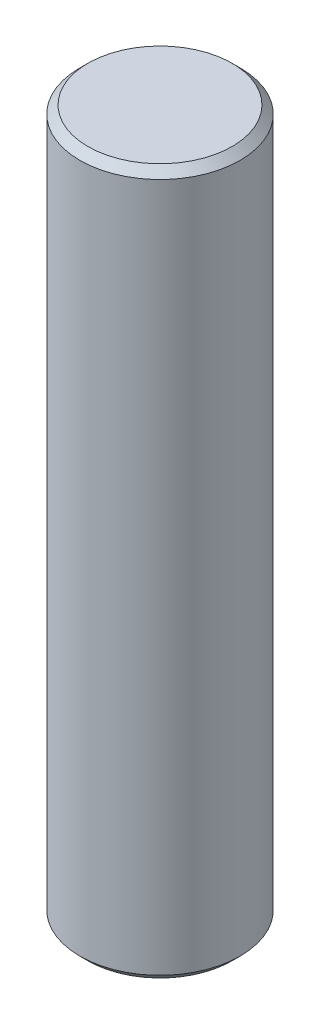
ISO-10303-21;
HEADER;
FILE_DESCRIPTION(('STEP AP214'),'2;1');
FILE_NAME('part.step','',(''),(''),'','','');
FILE_SCHEMA(('AUTOMOTIVE_DESIGN { 1 0 10303 214 1 1 1 1 }'));
ENDSEC;
DATA;
#1=APPLICATION_CONTEXT('core data for automotive mechanical design processes');
#2=APPLICATION_PROTOCOL_DEFINITION('international standard','automotive_design',2000,#1);
#3=PRODUCT_CONTEXT('',#1,'mechanical');
#4=PRODUCT('Part','Part','',(#3));
#5=PRODUCT_RELATED_PRODUCT_CATEGORY('part','',(#4));
#6=PRODUCT_DEFINITION_FORMATION('','',#4);
#7=PRODUCT_DEFINITION_CONTEXT('part definition',#1,'design');
#8=PRODUCT_DEFINITION('design','',#6,#7);
#9=PRODUCT_DEFINITION_SHAPE('','',#8);
#10=(LENGTH_UNIT() NAMED_UNIT(*) SI_UNIT(.MILLI.,.METRE.));
#11=(NAMED_UNIT(*) PLANE_ANGLE_UNIT() SI_UNIT($,.RADIAN.));
#12=(NAMED_UNIT(*) SI_UNIT($,.STERADIAN.) SOLID_ANGLE_UNIT());
#13=UNCERTAINTY_MEASURE_WITH_UNIT(LENGTH_MEASURE(1.E-05),#10,'distance_accuracy_value','');
#14=(GEOMETRIC_REPRESENTATION_CONTEXT(3) GLOBAL_UNCERTAINTY_ASSIGNED_CONTEXT((#13)) GLOBAL_UNIT_ASSIGNED_CONTEXT((#10,
#11,#12)) REPRESENTATION_CONTEXT('',''));
#15=CARTESIAN_POINT('',(0.,0.,0.));
#16=DIRECTION('',(0.,0.,1.));
#17=DIRECTION('',(1.,0.,0.));
#18=AXIS2_PLACEMENT_3D('',#15,#16,#17);
#19=CARTESIAN_POINT('',(0.,11.,0.));
#20=DIRECTION('',(0.,-1.,0.));
#21=DIRECTION('',(0.,0.,-1.));
#22=AXIS2_PLACEMENT_3D('',#19,#20,#21);
#23=CYLINDRICAL_SURFACE('',#22,2.5);
#24=CARTESIAN_POINT('',(0.,-10.75,0.));
#25=DIRECTION('',(0.,1.,0.));
#26=DIRECTION('',(0.,0.,1.));
#27=AXIS2_PLACEMENT_3D('',#24,#25,#26);
#28=CIRCLE('',#27,2.5);
#29=CARTESIAN_POINT('',(0.,-10.75,2.5));
#30=VERTEX_POINT('',#29);
#31=EDGE_CURVE('E49',#30,#30,#28,.T.);
#32=ORIENTED_EDGE('',*,*,#31,.T.);
#33=EDGE_LOOP('',(#32));
#34=FACE_BOUND('',#33,.T.);
#35=CARTESIAN_POINT('',(0.,10.75,0.));
#36=DIRECTION('',(0.,1.,0.));
#37=DIRECTION('',(0.,0.,1.));
#38=AXIS2_PLACEMENT_3D('',#35,#36,#37);
#39=CIRCLE('',#38,2.5);
#40=CARTESIAN_POINT('',(0.,10.75,2.5));
#41=VERTEX_POINT('',#40);
#42=EDGE_CURVE('E53',#41,#41,#39,.F.);
#43=ORIENTED_EDGE('',*,*,#42,.T.);
#44=EDGE_LOOP('',(#43));
#45=FACE_BOUND('',#44,.T.);
#46=ADVANCED_FACE('F37',(#34,#45),#23,.T.);
#47=CARTESIAN_POINT('',(0.,11.,0.));
#48=DIRECTION('',(0.,1.,0.));
#49=DIRECTION('',(0.,0.,1.));
#50=AXIS2_PLACEMENT_3D('',#47,#48,#49);
#51=PLANE('',#50);
#52=CARTESIAN_POINT('',(0.,11.,0.));
#53=DIRECTION('',(0.,1.,0.));
#54=DIRECTION('',(0.,0.,1.));
#55=AXIS2_PLACEMENT_3D('',#52,#53,#54);
#56=CIRCLE('',#55,2.25);
#57=CARTESIAN_POINT('',(0.,11.,2.25));
#58=VERTEX_POINT('',#57);
#59=EDGE_CURVE('E10',#58,#58,#56,.T.);
#60=ORIENTED_EDGE('',*,*,#59,.T.);
#61=EDGE_LOOP('',(#60));
#62=FACE_BOUND('',#61,.T.);
#63=ADVANCED_FACE('F69',(#62),#51,.T.);
#64=CARTESIAN_POINT('',(0.,-11.,0.));
#65=DIRECTION('',(0.,1.,0.));
#66=DIRECTION('',(0.,0.,1.));
#67=AXIS2_PLACEMENT_3D('',#64,#65,#66);
#68=PLANE('',#67);
#69=CARTESIAN_POINT('',(0.,-11.,0.));
#70=DIRECTION('',(0.,1.,0.));
#71=DIRECTION('',(0.,0.,1.));
#72=AXIS2_PLACEMENT_3D('',#69,#70,#71);
#73=CIRCLE('',#72,2.25);
#74=CARTESIAN_POINT('',(0.,-11.,2.25));
#75=VERTEX_POINT('',#74);
#76=EDGE_CURVE('E45',#75,#75,#73,.F.);
#77=ORIENTED_EDGE('',*,*,#76,.T.);
#78=EDGE_LOOP('',(#77));
#79=FACE_BOUND('',#78,.T.);
#80=ADVANCED_FACE('F66',(#79),#68,.F.);
#81=CARTESIAN_POINT('',(0.,-10.75,0.));
#82=DIRECTION('',(0.,1.,0.));
#83=DIRECTION('',(0.,0.,1.));
#84=AXIS2_PLACEMENT_3D('',#81,#82,#83);
#85=CONICAL_SURFACE('',#84,2.5,0.785398163397451);
#86=ORIENTED_EDGE('',*,*,#76,.F.);
#87=EDGE_LOOP('',(#86));
#88=FACE_BOUND('',#87,.T.);
#89=ORIENTED_EDGE('',*,*,#31,.F.);
#90=EDGE_LOOP('',(#89));
#91=FACE_BOUND('',#90,.T.);
#92=ADVANCED_FACE('F62',(#88,#91),#85,.T.);
#93=CARTESIAN_POINT('',(0.,11.,0.));
#94=DIRECTION('',(0.,-1.,0.));
#95=DIRECTION('',(0.,0.,-1.));
#96=AXIS2_PLACEMENT_3D('',#93,#94,#95);
#97=CONICAL_SURFACE('',#96,2.25,0.785398163397444);
#98=ORIENTED_EDGE('',*,*,#42,.F.);
#99=EDGE_LOOP('',(#98));
#100=FACE_BOUND('',#99,.T.);
#101=ORIENTED_EDGE('',*,*,#59,.F.);
#102=EDGE_LOOP('',(#101));
#103=FACE_BOUND('',#102,.T.);
#104=ADVANCED_FACE('F40',(#100,#103),#97,.T.);
#105=CLOSED_SHELL('',(#46,#63,#80,#92,#104));
#106=MANIFOLD_SOLID_BREP('B2',#105);
#107=ADVANCED_BREP_SHAPE_REPRESENTATION('',(#18,#106),#14);
#108=SHAPE_DEFINITION_REPRESENTATION(#9,#107);
ENDSEC;
END-ISO-10303-21;
